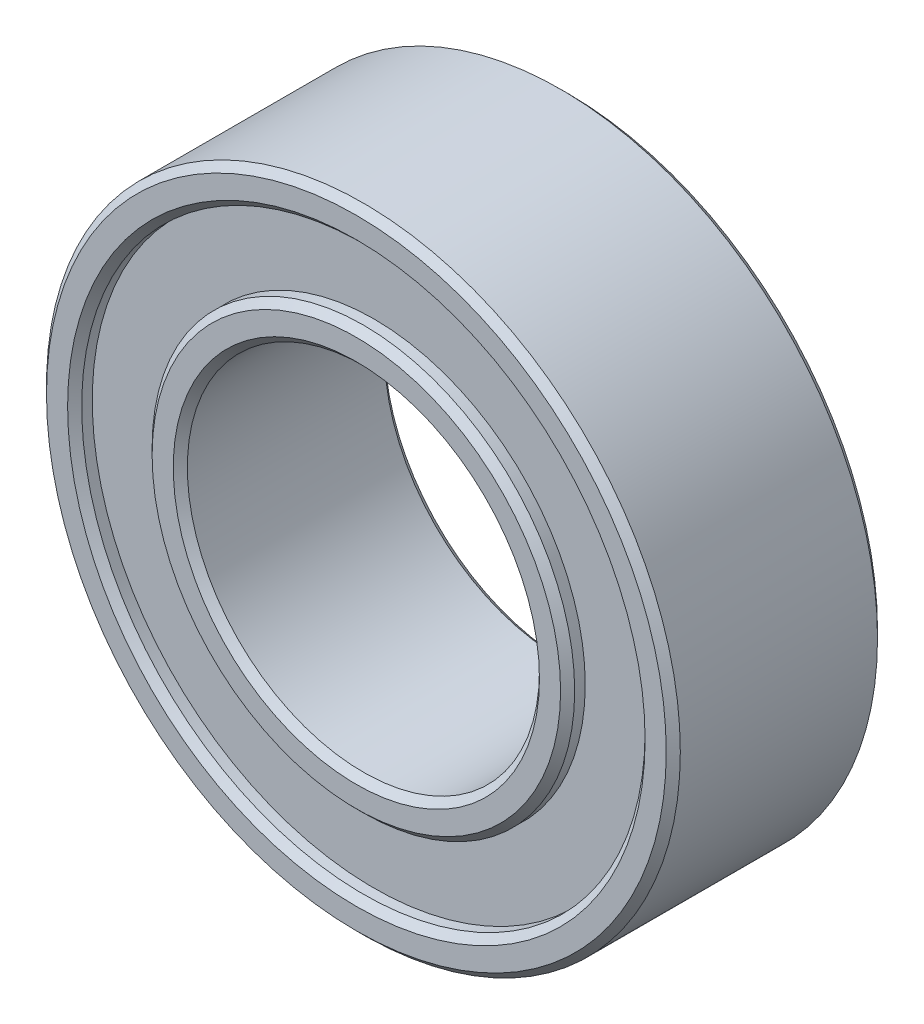
ISO-10303-21;
HEADER;
FILE_DESCRIPTION(('STEP AP214'),'2;1');
FILE_NAME('part.step','',(''),(''),'','','');
FILE_SCHEMA(('AUTOMOTIVE_DESIGN { 1 0 10303 214 1 1 1 1 }'));
ENDSEC;
DATA;
#1=APPLICATION_CONTEXT('core data for automotive mechanical design processes');
#2=APPLICATION_PROTOCOL_DEFINITION('international standard','automotive_design',2000,#1);
#3=PRODUCT_CONTEXT('',#1,'mechanical');
#4=PRODUCT('Part','Part','',(#3));
#5=PRODUCT_RELATED_PRODUCT_CATEGORY('part','',(#4));
#6=PRODUCT_DEFINITION_FORMATION('','',#4);
#7=PRODUCT_DEFINITION_CONTEXT('part definition',#1,'design');
#8=PRODUCT_DEFINITION('design','',#6,#7);
#9=PRODUCT_DEFINITION_SHAPE('','',#8);
#10=(LENGTH_UNIT() NAMED_UNIT(*) SI_UNIT(.MILLI.,.METRE.));
#11=(NAMED_UNIT(*) PLANE_ANGLE_UNIT() SI_UNIT($,.RADIAN.));
#12=(NAMED_UNIT(*) SI_UNIT($,.STERADIAN.) SOLID_ANGLE_UNIT());
#13=UNCERTAINTY_MEASURE_WITH_UNIT(LENGTH_MEASURE(1.E-05),#10,'distance_accuracy_value','');
#14=(GEOMETRIC_REPRESENTATION_CONTEXT(3) GLOBAL_UNCERTAINTY_ASSIGNED_CONTEXT((#13)) GLOBAL_UNIT_ASSIGNED_CONTEXT((#10,
#11,#12)) REPRESENTATION_CONTEXT('',''));
#15=CARTESIAN_POINT('',(0.,0.,0.));
#16=DIRECTION('',(0.,0.,1.));
#17=DIRECTION('',(1.,0.,0.));
#18=AXIS2_PLACEMENT_3D('',#15,#16,#17);
#19=CARTESIAN_POINT('',(0.,0.,0.));
#20=DIRECTION('',(0.,0.,1.));
#21=DIRECTION('',(1.,0.,0.));
#22=AXIS2_PLACEMENT_3D('',#19,#20,#21);
#23=PLANE('',#22);
#24=CARTESIAN_POINT('',(0.,0.,0.));
#25=DIRECTION('',(0.,0.,1.));
#26=DIRECTION('',(1.,0.,0.));
#27=AXIS2_PLACEMENT_3D('',#24,#25,#26);
#28=CIRCLE('',#27,2.6);
#29=CARTESIAN_POINT('',(2.6,0.,0.));
#30=VERTEX_POINT('',#29);
#31=EDGE_CURVE('E45',#30,#30,#28,.T.);
#32=ORIENTED_EDGE('',*,*,#31,.T.);
#33=EDGE_LOOP('',(#32));
#34=FACE_BOUND('',#33,.T.);
#35=CARTESIAN_POINT('',(0.,0.,0.));
#36=DIRECTION('',(0.,0.,1.));
#37=DIRECTION('',(1.,0.,0.));
#38=AXIS2_PLACEMENT_3D('',#35,#36,#37);
#39=CIRCLE('',#38,2.9);
#40=CARTESIAN_POINT('',(2.9,0.,0.));
#41=VERTEX_POINT('',#40);
#42=EDGE_CURVE('E49',#41,#41,#39,.F.);
#43=ORIENTED_EDGE('',*,*,#42,.T.);
#44=EDGE_LOOP('',(#43));
#45=FACE_BOUND('',#44,.T.);
#46=ADVANCED_FACE('F34',(#34,#45),#23,.F.);
#47=CARTESIAN_POINT('',(0.,0.,3.));
#48=DIRECTION('',(0.,0.,1.));
#49=DIRECTION('',(1.,0.,0.));
#50=AXIS2_PLACEMENT_3D('',#47,#48,#49);
#51=PLANE('',#50);
#52=CARTESIAN_POINT('',(0.,0.,3.));
#53=DIRECTION('',(0.,0.,1.));
#54=DIRECTION('',(1.,0.,0.));
#55=AXIS2_PLACEMENT_3D('',#52,#53,#54);
#56=CIRCLE('',#55,2.6);
#57=CARTESIAN_POINT('',(2.6,0.,3.));
#58=VERTEX_POINT('',#57);
#59=EDGE_CURVE('E78',#58,#58,#56,.F.);
#60=ORIENTED_EDGE('',*,*,#59,.T.);
#61=EDGE_LOOP('',(#60));
#62=FACE_BOUND('',#61,.T.);
#63=CARTESIAN_POINT('',(0.,0.,3.));
#64=DIRECTION('',(0.,0.,1.));
#65=DIRECTION('',(1.,0.,0.));
#66=AXIS2_PLACEMENT_3D('',#63,#64,#65);
#67=CIRCLE('',#66,2.9);
#68=CARTESIAN_POINT('',(2.9,0.,3.));
#69=VERTEX_POINT('',#68);
#70=EDGE_CURVE('E81',#69,#69,#67,.T.);
#71=ORIENTED_EDGE('',*,*,#70,.T.);
#72=EDGE_LOOP('',(#71));
#73=FACE_BOUND('',#72,.T.);
#74=ADVANCED_FACE('F122',(#62,#73),#51,.T.);
#75=CARTESIAN_POINT('',(0.,0.,3.));
#76=DIRECTION('',(0.,0.,-1.));
#77=DIRECTION('',(-1.,0.,0.));
#78=AXIS2_PLACEMENT_3D('',#75,#76,#77);
#79=CYLINDRICAL_SURFACE('',#78,4.5);
#80=CARTESIAN_POINT('',(0.,0.,2.9));
#81=DIRECTION('',(0.,0.,1.));
#82=DIRECTION('',(1.,0.,0.));
#83=AXIS2_PLACEMENT_3D('',#80,#81,#82);
#84=CIRCLE('',#83,4.5);
#85=CARTESIAN_POINT('',(4.5,0.,2.9));
#86=VERTEX_POINT('',#85);
#87=EDGE_CURVE('E63',#86,#86,#84,.F.);
#88=ORIENTED_EDGE('',*,*,#87,.T.);
#89=EDGE_LOOP('',(#88));
#90=FACE_BOUND('',#89,.T.);
#91=CARTESIAN_POINT('',(0.,0.,0.0999999999999985));
#92=DIRECTION('',(0.,0.,1.));
#93=DIRECTION('',(1.,0.,0.));
#94=AXIS2_PLACEMENT_3D('',#91,#92,#93);
#95=CIRCLE('',#94,4.5);
#96=CARTESIAN_POINT('',(4.5,0.,0.0999999999999985));
#97=VERTEX_POINT('',#96);
#98=EDGE_CURVE('E66',#97,#97,#95,.T.);
#99=ORIENTED_EDGE('',*,*,#98,.T.);
#100=EDGE_LOOP('',(#99));
#101=FACE_BOUND('',#100,.T.);
#102=ADVANCED_FACE('F129',(#90,#101),#79,.T.);
#103=CARTESIAN_POINT('',(0.,0.,3.));
#104=DIRECTION('',(0.,0.,1.));
#105=DIRECTION('',(1.,0.,0.));
#106=AXIS2_PLACEMENT_3D('',#103,#104,#105);
#107=CIRCLE('',#106,4.4);
#108=CARTESIAN_POINT('',(4.4,0.,3.));
#109=VERTEX_POINT('',#108);
#110=EDGE_CURVE('E69',#109,#109,#107,.T.);
#111=ORIENTED_EDGE('',*,*,#110,.T.);
#112=EDGE_LOOP('',(#111));
#113=FACE_BOUND('',#112,.T.);
#114=CARTESIAN_POINT('',(0.,0.,3.));
#115=DIRECTION('',(0.,0.,1.));
#116=DIRECTION('',(1.,0.,0.));
#117=AXIS2_PLACEMENT_3D('',#114,#115,#116);
#118=CIRCLE('',#117,4.1);
#119=CARTESIAN_POINT('',(4.1,0.,3.));
#120=VERTEX_POINT('',#119);
#121=EDGE_CURVE('E72',#120,#120,#118,.F.);
#122=ORIENTED_EDGE('',*,*,#121,.T.);
#123=EDGE_LOOP('',(#122));
#124=FACE_BOUND('',#123,.T.);
#125=ADVANCED_FACE('F132',(#113,#124),#51,.T.);
#126=CARTESIAN_POINT('',(0.,0.,0.));
#127=DIRECTION('',(0.,0.,1.));
#128=DIRECTION('',(1.,0.,0.));
#129=AXIS2_PLACEMENT_3D('',#126,#127,#128);
#130=CIRCLE('',#129,4.4);
#131=CARTESIAN_POINT('',(4.4,0.,0.));
#132=VERTEX_POINT('',#131);
#133=EDGE_CURVE('E54',#132,#132,#130,.F.);
#134=ORIENTED_EDGE('',*,*,#133,.T.);
#135=EDGE_LOOP('',(#134));
#136=FACE_BOUND('',#135,.T.);
#137=CARTESIAN_POINT('',(0.,0.,0.));
#138=DIRECTION('',(0.,0.,1.));
#139=DIRECTION('',(1.,0.,0.));
#140=AXIS2_PLACEMENT_3D('',#137,#138,#139);
#141=CIRCLE('',#140,4.1);
#142=CARTESIAN_POINT('',(4.1,0.,0.));
#143=VERTEX_POINT('',#142);
#144=EDGE_CURVE('E57',#143,#143,#141,.T.);
#145=ORIENTED_EDGE('',*,*,#144,.T.);
#146=EDGE_LOOP('',(#145));
#147=FACE_BOUND('',#146,.T.);
#148=ADVANCED_FACE('F125',(#136,#147),#23,.F.);
#149=CARTESIAN_POINT('',(0.,0.,0.));
#150=DIRECTION('',(0.,0.,1.));
#151=DIRECTION('',(1.,0.,0.));
#152=AXIS2_PLACEMENT_3D('',#149,#150,#151);
#153=CYLINDRICAL_SURFACE('',#152,2.5);
#154=CARTESIAN_POINT('',(0.,0.,2.9));
#155=DIRECTION('',(0.,0.,1.));
#156=DIRECTION('',(1.,0.,0.));
#157=AXIS2_PLACEMENT_3D('',#154,#155,#156);
#158=CIRCLE('',#157,2.5);
#159=CARTESIAN_POINT('',(2.5,0.,2.9));
#160=VERTEX_POINT('',#159);
#161=EDGE_CURVE('E84',#160,#160,#158,.T.);
#162=ORIENTED_EDGE('',*,*,#161,.T.);
#163=EDGE_LOOP('',(#162));
#164=FACE_BOUND('',#163,.T.);
#165=CARTESIAN_POINT('',(0.,0.,0.0999999999999994));
#166=DIRECTION('',(0.,0.,1.));
#167=DIRECTION('',(1.,0.,0.));
#168=AXIS2_PLACEMENT_3D('',#165,#166,#167);
#169=CIRCLE('',#168,2.5);
#170=CARTESIAN_POINT('',(2.5,0.,0.0999999999999994));
#171=VERTEX_POINT('',#170);
#172=EDGE_CURVE('E87',#171,#171,#169,.F.);
#173=ORIENTED_EDGE('',*,*,#172,.T.);
#174=EDGE_LOOP('',(#173));
#175=FACE_BOUND('',#174,.T.);
#176=ADVANCED_FACE('F136',(#164,#175),#153,.F.);
#177=CARTESIAN_POINT('',(0.,0.,2.75));
#178=DIRECTION('',(0.,0.,1.));
#179=DIRECTION('',(1.,0.,0.));
#180=AXIS2_PLACEMENT_3D('',#177,#178,#179);
#181=CYLINDRICAL_SURFACE('',#180,4.);
#182=CARTESIAN_POINT('',(0.,0.,2.9));
#183=DIRECTION('',(0.,0.,1.));
#184=DIRECTION('',(1.,0.,0.));
#185=AXIS2_PLACEMENT_3D('',#182,#183,#184);
#186=CIRCLE('',#185,4.);
#187=CARTESIAN_POINT('',(4.,0.,2.9));
#188=VERTEX_POINT('',#187);
#189=EDGE_CURVE('E60',#188,#188,#186,.T.);
#190=ORIENTED_EDGE('',*,*,#189,.T.);
#191=EDGE_LOOP('',(#190));
#192=FACE_BOUND('',#191,.T.);
#193=CARTESIAN_POINT('',(0.,0.,2.75));
#194=DIRECTION('',(0.,0.,1.));
#195=DIRECTION('',(1.,0.,0.));
#196=AXIS2_PLACEMENT_3D('',#193,#194,#195);
#197=CIRCLE('',#196,4.);
#198=CARTESIAN_POINT('',(4.,0.,2.75));
#199=VERTEX_POINT('',#198);
#200=EDGE_CURVE('E90',#199,#199,#197,.T.);
#201=ORIENTED_EDGE('',*,*,#200,.F.);
#202=EDGE_LOOP('',(#201));
#203=FACE_BOUND('',#202,.T.);
#204=ADVANCED_FACE('F142',(#192,#203),#181,.F.);
#205=CARTESIAN_POINT('',(0.,0.,2.75));
#206=DIRECTION('',(0.,0.,1.));
#207=DIRECTION('',(1.,0.,0.));
#208=AXIS2_PLACEMENT_3D('',#205,#206,#207);
#209=PLANE('',#208);
#210=CARTESIAN_POINT('',(0.,0.,2.75));
#211=DIRECTION('',(0.,0.,1.));
#212=DIRECTION('',(1.,0.,0.));
#213=AXIS2_PLACEMENT_3D('',#210,#211,#212);
#214=CIRCLE('',#213,3.);
#215=CARTESIAN_POINT('',(3.,0.,2.75));
#216=VERTEX_POINT('',#215);
#217=EDGE_CURVE('E93',#216,#216,#214,.T.);
#218=ORIENTED_EDGE('',*,*,#217,.F.);
#219=EDGE_LOOP('',(#218));
#220=FACE_BOUND('',#219,.T.);
#221=ORIENTED_EDGE('',*,*,#200,.T.);
#222=EDGE_LOOP('',(#221));
#223=FACE_BOUND('',#222,.T.);
#224=ADVANCED_FACE('F118',(#220,#223),#209,.T.);
#225=CARTESIAN_POINT('',(0.,0.,2.75));
#226=DIRECTION('',(0.,0.,1.));
#227=DIRECTION('',(1.,0.,0.));
#228=AXIS2_PLACEMENT_3D('',#225,#226,#227);
#229=CYLINDRICAL_SURFACE('',#228,3.);
#230=CARTESIAN_POINT('',(0.,0.,2.9));
#231=DIRECTION('',(0.,0.,1.));
#232=DIRECTION('',(1.,0.,0.));
#233=AXIS2_PLACEMENT_3D('',#230,#231,#232);
#234=CIRCLE('',#233,3.);
#235=CARTESIAN_POINT('',(3.,0.,2.9));
#236=VERTEX_POINT('',#235);
#237=EDGE_CURVE('E75',#236,#236,#234,.F.);
#238=ORIENTED_EDGE('',*,*,#237,.T.);
#239=EDGE_LOOP('',(#238));
#240=FACE_BOUND('',#239,.T.);
#241=ORIENTED_EDGE('',*,*,#217,.T.);
#242=EDGE_LOOP('',(#241));
#243=FACE_BOUND('',#242,.T.);
#244=ADVANCED_FACE('F113',(#240,#243),#229,.T.);
#245=CARTESIAN_POINT('',(0.,0.,0.25));
#246=DIRECTION('',(0.,0.,-1.));
#247=DIRECTION('',(-1.,0.,0.));
#248=AXIS2_PLACEMENT_3D('',#245,#246,#247);
#249=CYLINDRICAL_SURFACE('',#248,4.);
#250=CARTESIAN_POINT('',(0.,0.,0.100000000000003));
#251=DIRECTION('',(0.,0.,1.));
#252=DIRECTION('',(1.,0.,0.));
#253=AXIS2_PLACEMENT_3D('',#250,#251,#252);
#254=CIRCLE('',#253,4.);
#255=CARTESIAN_POINT('',(4.,0.,0.100000000000003));
#256=VERTEX_POINT('',#255);
#257=EDGE_CURVE('E10',#256,#256,#254,.F.);
#258=ORIENTED_EDGE('',*,*,#257,.T.);
#259=EDGE_LOOP('',(#258));
#260=FACE_BOUND('',#259,.T.);
#261=CARTESIAN_POINT('',(0.,0.,0.25));
#262=DIRECTION('',(0.,0.,-1.));
#263=DIRECTION('',(-1.,0.,0.));
#264=AXIS2_PLACEMENT_3D('',#261,#262,#263);
#265=CIRCLE('',#264,4.);
#266=CARTESIAN_POINT('',(-4.,0.,0.25));
#267=VERTEX_POINT('',#266);
#268=EDGE_CURVE('E96',#267,#267,#265,.T.);
#269=ORIENTED_EDGE('',*,*,#268,.F.);
#270=EDGE_LOOP('',(#269));
#271=FACE_BOUND('',#270,.T.);
#272=ADVANCED_FACE('F108',(#260,#271),#249,.F.);
#273=CARTESIAN_POINT('',(0.,0.,0.25));
#274=DIRECTION('',(0.,0.,-1.));
#275=DIRECTION('',(-1.,0.,0.));
#276=AXIS2_PLACEMENT_3D('',#273,#274,#275);
#277=PLANE('',#276);
#278=CARTESIAN_POINT('',(0.,0.,0.25));
#279=DIRECTION('',(0.,0.,-1.));
#280=DIRECTION('',(-1.,0.,0.));
#281=AXIS2_PLACEMENT_3D('',#278,#279,#280);
#282=CIRCLE('',#281,3.);
#283=CARTESIAN_POINT('',(-3.,0.,0.25));
#284=VERTEX_POINT('',#283);
#285=EDGE_CURVE('E99',#284,#284,#282,.T.);
#286=ORIENTED_EDGE('',*,*,#285,.F.);
#287=EDGE_LOOP('',(#286));
#288=FACE_BOUND('',#287,.T.);
#289=ORIENTED_EDGE('',*,*,#268,.T.);
#290=EDGE_LOOP('',(#289));
#291=FACE_BOUND('',#290,.T.);
#292=ADVANCED_FACE('F105',(#288,#291),#277,.T.);
#293=CARTESIAN_POINT('',(0.,0.,0.25));
#294=DIRECTION('',(0.,0.,-1.));
#295=DIRECTION('',(-1.,0.,0.));
#296=AXIS2_PLACEMENT_3D('',#293,#294,#295);
#297=CYLINDRICAL_SURFACE('',#296,3.);
#298=CARTESIAN_POINT('',(0.,0.,0.0999999999999985));
#299=DIRECTION('',(0.,0.,1.));
#300=DIRECTION('',(1.,0.,0.));
#301=AXIS2_PLACEMENT_3D('',#298,#299,#300);
#302=CIRCLE('',#301,3.);
#303=CARTESIAN_POINT('',(3.,0.,0.0999999999999985));
#304=VERTEX_POINT('',#303);
#305=EDGE_CURVE('E41',#304,#304,#302,.T.);
#306=ORIENTED_EDGE('',*,*,#305,.T.);
#307=EDGE_LOOP('',(#306));
#308=FACE_BOUND('',#307,.T.);
#309=ORIENTED_EDGE('',*,*,#285,.T.);
#310=EDGE_LOOP('',(#309));
#311=FACE_BOUND('',#310,.T.);
#312=ADVANCED_FACE('F103',(#308,#311),#297,.T.);
#313=CARTESIAN_POINT('',(0.,0.,2.9));
#314=DIRECTION('',(0.,0.,1.));
#315=DIRECTION('',(1.,0.,0.));
#316=AXIS2_PLACEMENT_3D('',#313,#314,#315);
#317=CONICAL_SURFACE('',#316,2.5,0.78539816339745);
#318=ORIENTED_EDGE('',*,*,#59,.F.);
#319=EDGE_LOOP('',(#318));
#320=FACE_BOUND('',#319,.T.);
#321=ORIENTED_EDGE('',*,*,#161,.F.);
#322=EDGE_LOOP('',(#321));
#323=FACE_BOUND('',#322,.T.);
#324=ADVANCED_FACE('F180',(#320,#323),#317,.F.);
#325=CARTESIAN_POINT('',(0.,0.,3.));
#326=DIRECTION('',(0.,0.,-1.));
#327=DIRECTION('',(-1.,0.,0.));
#328=AXIS2_PLACEMENT_3D('',#325,#326,#327);
#329=CONICAL_SURFACE('',#328,2.9,0.785398163397453);
#330=ORIENTED_EDGE('',*,*,#237,.F.);
#331=EDGE_LOOP('',(#330));
#332=FACE_BOUND('',#331,.T.);
#333=ORIENTED_EDGE('',*,*,#70,.F.);
#334=EDGE_LOOP('',(#333));
#335=FACE_BOUND('',#334,.T.);
#336=ADVANCED_FACE('F176',(#332,#335),#329,.T.);
#337=CARTESIAN_POINT('',(0.,0.,3.));
#338=DIRECTION('',(0.,0.,-1.));
#339=DIRECTION('',(-1.,0.,0.));
#340=AXIS2_PLACEMENT_3D('',#337,#338,#339);
#341=CONICAL_SURFACE('',#340,4.4,0.785398163397448);
#342=ORIENTED_EDGE('',*,*,#87,.F.);
#343=EDGE_LOOP('',(#342));
#344=FACE_BOUND('',#343,.T.);
#345=ORIENTED_EDGE('',*,*,#110,.F.);
#346=EDGE_LOOP('',(#345));
#347=FACE_BOUND('',#346,.T.);
#348=ADVANCED_FACE('F172',(#344,#347),#341,.T.);
#349=CARTESIAN_POINT('',(0.,0.,2.9));
#350=DIRECTION('',(0.,0.,1.));
#351=DIRECTION('',(1.,0.,0.));
#352=AXIS2_PLACEMENT_3D('',#349,#350,#351);
#353=CONICAL_SURFACE('',#352,4.,0.785398163397461);
#354=ORIENTED_EDGE('',*,*,#121,.F.);
#355=EDGE_LOOP('',(#354));
#356=FACE_BOUND('',#355,.T.);
#357=ORIENTED_EDGE('',*,*,#189,.F.);
#358=EDGE_LOOP('',(#357));
#359=FACE_BOUND('',#358,.T.);
#360=ADVANCED_FACE('F168',(#356,#359),#353,.F.);
#361=CARTESIAN_POINT('',(0.,0.,0.0999999999999985));
#362=DIRECTION('',(0.,0.,1.));
#363=DIRECTION('',(1.,0.,0.));
#364=AXIS2_PLACEMENT_3D('',#361,#362,#363);
#365=CONICAL_SURFACE('',#364,4.5,0.785398163397453);
#366=ORIENTED_EDGE('',*,*,#133,.F.);
#367=EDGE_LOOP('',(#366));
#368=FACE_BOUND('',#367,.T.);
#369=ORIENTED_EDGE('',*,*,#98,.F.);
#370=EDGE_LOOP('',(#369));
#371=FACE_BOUND('',#370,.T.);
#372=ADVANCED_FACE('F161',(#368,#371),#365,.T.);
#373=CARTESIAN_POINT('',(0.,0.,0.));
#374=DIRECTION('',(0.,0.,-1.));
#375=DIRECTION('',(-1.,0.,0.));
#376=AXIS2_PLACEMENT_3D('',#373,#374,#375);
#377=CONICAL_SURFACE('',#376,2.6,0.78539816339745);
#378=ORIENTED_EDGE('',*,*,#172,.F.);
#379=EDGE_LOOP('',(#378));
#380=FACE_BOUND('',#379,.T.);
#381=ORIENTED_EDGE('',*,*,#31,.F.);
#382=EDGE_LOOP('',(#381));
#383=FACE_BOUND('',#382,.T.);
#384=ADVANCED_FACE('F156',(#380,#383),#377,.F.);
#385=CARTESIAN_POINT('',(0.,0.,0.));
#386=DIRECTION('',(0.,0.,1.));
#387=DIRECTION('',(1.,0.,0.));
#388=AXIS2_PLACEMENT_3D('',#385,#386,#387);
#389=CONICAL_SURFACE('',#388,2.9,0.785398163397453);
#390=ORIENTED_EDGE('',*,*,#305,.F.);
#391=EDGE_LOOP('',(#390));
#392=FACE_BOUND('',#391,.T.);
#393=ORIENTED_EDGE('',*,*,#42,.F.);
#394=EDGE_LOOP('',(#393));
#395=FACE_BOUND('',#394,.T.);
#396=ADVANCED_FACE('F152',(#392,#395),#389,.T.);
#397=CARTESIAN_POINT('',(0.,0.,0.100000000000003));
#398=DIRECTION('',(0.,0.,-1.));
#399=DIRECTION('',(-1.,0.,0.));
#400=AXIS2_PLACEMENT_3D('',#397,#398,#399);
#401=CONICAL_SURFACE('',#400,4.,0.785398163397457);
#402=ORIENTED_EDGE('',*,*,#144,.F.);
#403=EDGE_LOOP('',(#402));
#404=FACE_BOUND('',#403,.T.);
#405=ORIENTED_EDGE('',*,*,#257,.F.);
#406=EDGE_LOOP('',(#405));
#407=FACE_BOUND('',#406,.T.);
#408=ADVANCED_FACE('F36',(#404,#407),#401,.F.);
#409=CLOSED_SHELL('',(#46,#74,#102,#125,#148,#176,#204,#224,#244,#272,#292,#312,#324,#336,#348,
#360,#372,#384,#396,#408));
#410=MANIFOLD_SOLID_BREP('B2',#409);
#411=ADVANCED_BREP_SHAPE_REPRESENTATION('',(#18,#410),#14);
#412=SHAPE_DEFINITION_REPRESENTATION(#9,#411);
ENDSEC;
END-ISO-10303-21;
